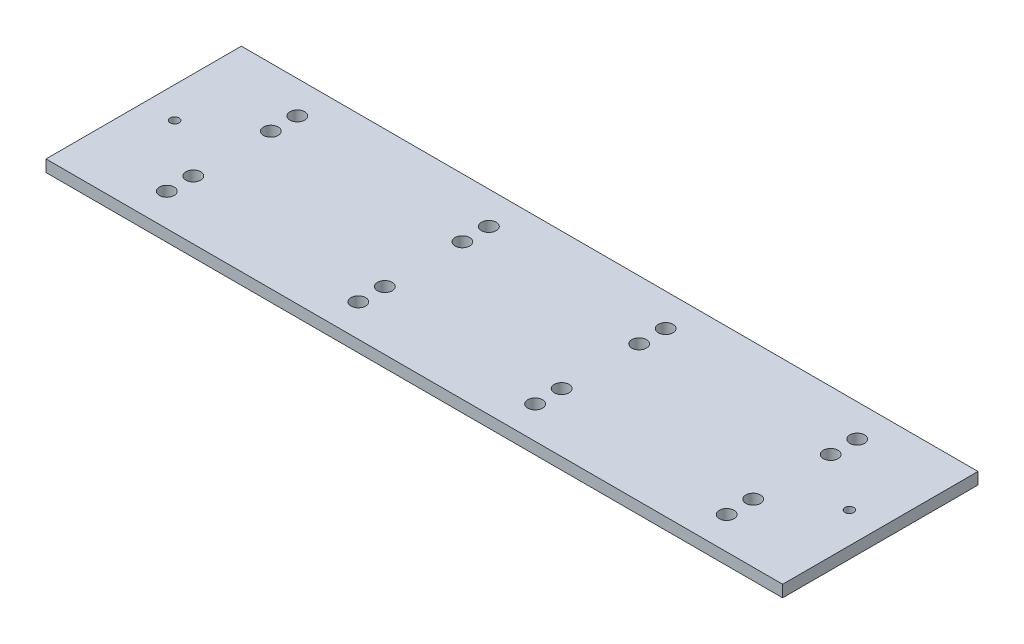
ISO-10303-21;
HEADER;
FILE_DESCRIPTION(('STEP AP214'),'2;1');
FILE_NAME('part.step','',(''),(''),'','','');
FILE_SCHEMA(('AUTOMOTIVE_DESIGN { 1 0 10303 214 1 1 1 1 }'));
ENDSEC;
DATA;
#1=APPLICATION_CONTEXT('core data for automotive mechanical design processes');
#2=APPLICATION_PROTOCOL_DEFINITION('international standard','automotive_design',2000,#1);
#3=PRODUCT_CONTEXT('',#1,'mechanical');
#4=PRODUCT('Part','Part','',(#3));
#5=PRODUCT_RELATED_PRODUCT_CATEGORY('part','',(#4));
#6=PRODUCT_DEFINITION_FORMATION('','',#4);
#7=PRODUCT_DEFINITION_CONTEXT('part definition',#1,'design');
#8=PRODUCT_DEFINITION('design','',#6,#7);
#9=PRODUCT_DEFINITION_SHAPE('','',#8);
#10=(LENGTH_UNIT() NAMED_UNIT(*) SI_UNIT(.MILLI.,.METRE.));
#11=(NAMED_UNIT(*) PLANE_ANGLE_UNIT() SI_UNIT($,.RADIAN.));
#12=(NAMED_UNIT(*) SI_UNIT($,.STERADIAN.) SOLID_ANGLE_UNIT());
#13=UNCERTAINTY_MEASURE_WITH_UNIT(LENGTH_MEASURE(1.E-05),#10,'distance_accuracy_value','');
#14=(GEOMETRIC_REPRESENTATION_CONTEXT(3) GLOBAL_UNCERTAINTY_ASSIGNED_CONTEXT((#13)) GLOBAL_UNIT_ASSIGNED_CONTEXT((#10,
#11,#12)) REPRESENTATION_CONTEXT('',''));
#15=CARTESIAN_POINT('',(0.,0.,0.));
#16=DIRECTION('',(0.,0.,1.));
#17=DIRECTION('',(1.,0.,0.));
#18=AXIS2_PLACEMENT_3D('',#15,#16,#17);
#19=CARTESIAN_POINT('',(-125.,4.,-33.15));
#20=DIRECTION('',(1.,0.,0.));
#21=DIRECTION('',(0.,0.,-1.));
#22=AXIS2_PLACEMENT_3D('',#19,#20,#21);
#23=PLANE('',#22);
#24=DIRECTION('',(0.,0.,1.));
#25=VECTOR('',#24,1.);
#26=CARTESIAN_POINT('',(-125.,0.,-33.15));
#27=LINE('',#26,#25);
#28=CARTESIAN_POINT('',(-125.,0.,-33.15));
#29=VERTEX_POINT('',#28);
#30=CARTESIAN_POINT('',(-125.,0.,33.15));
#31=VERTEX_POINT('',#30);
#32=EDGE_CURVE('E105',#29,#31,#27,.T.);
#33=ORIENTED_EDGE('',*,*,#32,.T.);
#34=DIRECTION('',(0.,-1.,0.));
#35=VECTOR('',#34,1.);
#36=CARTESIAN_POINT('',(-125.,4.,33.15));
#37=LINE('',#36,#35);
#38=CARTESIAN_POINT('',(-125.,4.,33.15));
#39=VERTEX_POINT('',#38);
#40=EDGE_CURVE('E11',#39,#31,#37,.T.);
#41=ORIENTED_EDGE('',*,*,#40,.F.);
#42=DIRECTION('',(0.,0.,1.));
#43=VECTOR('',#42,1.);
#44=CARTESIAN_POINT('',(-125.,4.,-33.15));
#45=LINE('',#44,#43);
#46=CARTESIAN_POINT('',(-125.,4.,-33.15));
#47=VERTEX_POINT('',#46);
#48=EDGE_CURVE('E92',#47,#39,#45,.T.);
#49=ORIENTED_EDGE('',*,*,#48,.F.);
#50=DIRECTION('',(0.,-1.,0.));
#51=VECTOR('',#50,1.);
#52=CARTESIAN_POINT('',(-125.,4.,-33.15));
#53=LINE('',#52,#51);
#54=EDGE_CURVE('E101',#47,#29,#53,.T.);
#55=ORIENTED_EDGE('',*,*,#54,.T.);
#56=EDGE_LOOP('',(#33,#41,#49,#55));
#57=FACE_BOUND('',#56,.T.);
#58=ADVANCED_FACE('F39',(#57),#23,.F.);
#59=CARTESIAN_POINT('',(-125.,4.,33.15));
#60=DIRECTION('',(0.,0.,-1.));
#61=DIRECTION('',(-1.,0.,0.));
#62=AXIS2_PLACEMENT_3D('',#59,#60,#61);
#63=PLANE('',#62);
#64=DIRECTION('',(1.,0.,0.));
#65=VECTOR('',#64,1.);
#66=CARTESIAN_POINT('',(-125.,0.,33.15));
#67=LINE('',#66,#65);
#68=CARTESIAN_POINT('',(125.,0.,33.15));
#69=VERTEX_POINT('',#68);
#70=EDGE_CURVE('E96',#31,#69,#67,.T.);
#71=ORIENTED_EDGE('',*,*,#70,.T.);
#72=DIRECTION('',(0.,-1.,0.));
#73=VECTOR('',#72,1.);
#74=CARTESIAN_POINT('',(125.,4.,33.15));
#75=LINE('',#74,#73);
#76=CARTESIAN_POINT('',(125.,4.,33.15));
#77=VERTEX_POINT('',#76);
#78=EDGE_CURVE('E48',#77,#69,#75,.T.);
#79=ORIENTED_EDGE('',*,*,#78,.F.);
#80=DIRECTION('',(1.,0.,0.));
#81=VECTOR('',#80,1.);
#82=CARTESIAN_POINT('',(-125.,4.,33.15));
#83=LINE('',#82,#81);
#84=EDGE_CURVE('E87',#39,#77,#83,.T.);
#85=ORIENTED_EDGE('',*,*,#84,.F.);
#86=ORIENTED_EDGE('',*,*,#40,.T.);
#87=EDGE_LOOP('',(#71,#79,#85,#86));
#88=FACE_BOUND('',#87,.T.);
#89=ADVANCED_FACE('F95',(#88),#63,.F.);
#90=CARTESIAN_POINT('',(125.,4.,-33.15));
#91=DIRECTION('',(-1.,0.,0.));
#92=DIRECTION('',(0.,0.,1.));
#93=AXIS2_PLACEMENT_3D('',#90,#91,#92);
#94=PLANE('',#93);
#95=DIRECTION('',(0.,0.,-1.));
#96=VECTOR('',#95,1.);
#97=CARTESIAN_POINT('',(125.,0.,-33.15));
#98=LINE('',#97,#96);
#99=CARTESIAN_POINT('',(125.,0.,-33.15));
#100=VERTEX_POINT('',#99);
#101=EDGE_CURVE('E74',#69,#100,#98,.T.);
#102=ORIENTED_EDGE('',*,*,#101,.T.);
#103=DIRECTION('',(0.,-1.,0.));
#104=VECTOR('',#103,1.);
#105=CARTESIAN_POINT('',(125.,4.,-33.15));
#106=LINE('',#105,#104);
#107=CARTESIAN_POINT('',(125.,4.,-33.15));
#108=VERTEX_POINT('',#107);
#109=EDGE_CURVE('E97',#108,#100,#106,.T.);
#110=ORIENTED_EDGE('',*,*,#109,.F.);
#111=DIRECTION('',(0.,0.,-1.));
#112=VECTOR('',#111,1.);
#113=CARTESIAN_POINT('',(125.,4.,-33.15));
#114=LINE('',#113,#112);
#115=EDGE_CURVE('E90',#77,#108,#114,.T.);
#116=ORIENTED_EDGE('',*,*,#115,.F.);
#117=ORIENTED_EDGE('',*,*,#78,.T.);
#118=EDGE_LOOP('',(#102,#110,#116,#117));
#119=FACE_BOUND('',#118,.T.);
#120=ADVANCED_FACE('F99',(#119),#94,.F.);
#121=CARTESIAN_POINT('',(-125.,4.,-33.15));
#122=DIRECTION('',(0.,0.,1.));
#123=DIRECTION('',(1.,0.,0.));
#124=AXIS2_PLACEMENT_3D('',#121,#122,#123);
#125=PLANE('',#124);
#126=DIRECTION('',(-1.,0.,0.));
#127=VECTOR('',#126,1.);
#128=CARTESIAN_POINT('',(-125.,0.,-33.15));
#129=LINE('',#128,#127);
#130=EDGE_CURVE('E80',#100,#29,#129,.T.);
#131=ORIENTED_EDGE('',*,*,#130,.T.);
#132=ORIENTED_EDGE('',*,*,#54,.F.);
#133=DIRECTION('',(-1.,0.,0.));
#134=VECTOR('',#133,1.);
#135=CARTESIAN_POINT('',(-125.,4.,-33.15));
#136=LINE('',#135,#134);
#137=EDGE_CURVE('E57',#108,#47,#136,.T.);
#138=ORIENTED_EDGE('',*,*,#137,.F.);
#139=ORIENTED_EDGE('',*,*,#109,.T.);
#140=EDGE_LOOP('',(#131,#132,#138,#139));
#141=FACE_BOUND('',#140,.T.);
#142=ADVANCED_FACE('F241',(#141),#125,.F.);
#143=CARTESIAN_POINT('',(0.,4.,0.));
#144=DIRECTION('',(0.,1.,0.));
#145=DIRECTION('',(0.,0.,1.));
#146=AXIS2_PLACEMENT_3D('',#143,#144,#145);
#147=PLANE('',#146);
#148=CARTESIAN_POINT('',(-30.0000000000001,4.,22.15));
#149=DIRECTION('',(0.,1.,0.));
#150=DIRECTION('',(0.,0.,1.));
#151=AXIS2_PLACEMENT_3D('',#148,#149,#150);
#152=CIRCLE('',#151,2.49999999999999);
#153=CARTESIAN_POINT('',(-30.0000000000001,4.,24.65));
#154=VERTEX_POINT('',#153);
#155=EDGE_CURVE('E451',#154,#154,#152,.T.);
#156=ORIENTED_EDGE('',*,*,#155,.F.);
#157=EDGE_LOOP('',(#156));
#158=FACE_BOUND('',#157,.T.);
#159=CARTESIAN_POINT('',(-30.0000000000001,4.,13.15));
#160=DIRECTION('',(0.,1.,0.));
#161=DIRECTION('',(0.,0.,1.));
#162=AXIS2_PLACEMENT_3D('',#159,#160,#161);
#163=CIRCLE('',#162,2.49999999999999);
#164=CARTESIAN_POINT('',(-30.0000000000001,4.,15.65));
#165=VERTEX_POINT('',#164);
#166=EDGE_CURVE('E152',#165,#165,#163,.T.);
#167=ORIENTED_EDGE('',*,*,#166,.F.);
#168=EDGE_LOOP('',(#167));
#169=FACE_BOUND('',#168,.T.);
#170=CARTESIAN_POINT('',(-95.0000000000001,4.,22.15));
#171=DIRECTION('',(0.,1.,0.));
#172=DIRECTION('',(0.,0.,1.));
#173=AXIS2_PLACEMENT_3D('',#170,#171,#172);
#174=CIRCLE('',#173,2.49999999999999);
#175=CARTESIAN_POINT('',(-95.0000000000001,4.,24.65));
#176=VERTEX_POINT('',#175);
#177=EDGE_CURVE('E142',#176,#176,#174,.T.);
#178=ORIENTED_EDGE('',*,*,#177,.F.);
#179=EDGE_LOOP('',(#178));
#180=FACE_BOUND('',#179,.T.);
#181=CARTESIAN_POINT('',(-95.0000000000001,4.,13.15));
#182=DIRECTION('',(0.,1.,0.));
#183=DIRECTION('',(0.,0.,1.));
#184=AXIS2_PLACEMENT_3D('',#181,#182,#183);
#185=CIRCLE('',#184,2.49999999999999);
#186=CARTESIAN_POINT('',(-95.0000000000001,4.,15.65));
#187=VERTEX_POINT('',#186);
#188=EDGE_CURVE('E139',#187,#187,#185,.T.);
#189=ORIENTED_EDGE('',*,*,#188,.F.);
#190=EDGE_LOOP('',(#189));
#191=FACE_BOUND('',#190,.T.);
#192=CARTESIAN_POINT('',(30.0000000000001,4.,22.15));
#193=DIRECTION('',(0.,1.,0.));
#194=DIRECTION('',(0.,0.,1.));
#195=AXIS2_PLACEMENT_3D('',#192,#193,#194);
#196=CIRCLE('',#195,2.49999999999999);
#197=CARTESIAN_POINT('',(30.0000000000001,4.,24.65));
#198=VERTEX_POINT('',#197);
#199=EDGE_CURVE('E136',#198,#198,#196,.T.);
#200=ORIENTED_EDGE('',*,*,#199,.F.);
#201=EDGE_LOOP('',(#200));
#202=FACE_BOUND('',#201,.T.);
#203=CARTESIAN_POINT('',(30.0000000000001,4.,13.15));
#204=DIRECTION('',(0.,1.,0.));
#205=DIRECTION('',(0.,0.,1.));
#206=AXIS2_PLACEMENT_3D('',#203,#204,#205);
#207=CIRCLE('',#206,2.49999999999999);
#208=CARTESIAN_POINT('',(30.0000000000001,4.,15.65));
#209=VERTEX_POINT('',#208);
#210=EDGE_CURVE('E135',#209,#209,#207,.T.);
#211=ORIENTED_EDGE('',*,*,#210,.F.);
#212=EDGE_LOOP('',(#211));
#213=FACE_BOUND('',#212,.T.);
#214=CARTESIAN_POINT('',(95.0000000000001,4.,22.15));
#215=DIRECTION('',(0.,1.,0.));
#216=DIRECTION('',(0.,0.,1.));
#217=AXIS2_PLACEMENT_3D('',#214,#215,#216);
#218=CIRCLE('',#217,2.49999999999999);
#219=CARTESIAN_POINT('',(95.0000000000001,4.,24.65));
#220=VERTEX_POINT('',#219);
#221=EDGE_CURVE('E131',#220,#220,#218,.T.);
#222=ORIENTED_EDGE('',*,*,#221,.F.);
#223=EDGE_LOOP('',(#222));
#224=FACE_BOUND('',#223,.T.);
#225=CARTESIAN_POINT('',(95.0000000000001,4.,13.15));
#226=DIRECTION('',(0.,1.,0.));
#227=DIRECTION('',(0.,0.,1.));
#228=AXIS2_PLACEMENT_3D('',#225,#226,#227);
#229=CIRCLE('',#228,2.49999999999999);
#230=CARTESIAN_POINT('',(95.0000000000001,4.,15.65));
#231=VERTEX_POINT('',#230);
#232=EDGE_CURVE('E127',#231,#231,#229,.T.);
#233=ORIENTED_EDGE('',*,*,#232,.F.);
#234=EDGE_LOOP('',(#233));
#235=FACE_BOUND('',#234,.T.);
#236=CARTESIAN_POINT('',(30.0000000000001,4.,-22.15));
#237=DIRECTION('',(0.,1.,0.));
#238=DIRECTION('',(0.,0.,1.));
#239=AXIS2_PLACEMENT_3D('',#236,#237,#238);
#240=CIRCLE('',#239,2.49999999999999);
#241=CARTESIAN_POINT('',(30.0000000000001,4.,-19.65));
#242=VERTEX_POINT('',#241);
#243=EDGE_CURVE('E123',#242,#242,#240,.T.);
#244=ORIENTED_EDGE('',*,*,#243,.F.);
#245=EDGE_LOOP('',(#244));
#246=FACE_BOUND('',#245,.T.);
#247=CARTESIAN_POINT('',(30.0000000000001,4.,-13.15));
#248=DIRECTION('',(0.,1.,0.));
#249=DIRECTION('',(0.,0.,1.));
#250=AXIS2_PLACEMENT_3D('',#247,#248,#249);
#251=CIRCLE('',#250,2.49999999999999);
#252=CARTESIAN_POINT('',(30.0000000000001,4.,-10.65));
#253=VERTEX_POINT('',#252);
#254=EDGE_CURVE('E122',#253,#253,#251,.T.);
#255=ORIENTED_EDGE('',*,*,#254,.F.);
#256=EDGE_LOOP('',(#255));
#257=FACE_BOUND('',#256,.T.);
#258=CARTESIAN_POINT('',(95.0000000000001,4.,-22.15));
#259=DIRECTION('',(0.,1.,0.));
#260=DIRECTION('',(0.,0.,1.));
#261=AXIS2_PLACEMENT_3D('',#258,#259,#260);
#262=CIRCLE('',#261,2.49999999999999);
#263=CARTESIAN_POINT('',(95.0000000000001,4.,-19.65));
#264=VERTEX_POINT('',#263);
#265=EDGE_CURVE('E174',#264,#264,#262,.T.);
#266=ORIENTED_EDGE('',*,*,#265,.F.);
#267=EDGE_LOOP('',(#266));
#268=FACE_BOUND('',#267,.T.);
#269=CARTESIAN_POINT('',(95.0000000000001,4.,-13.15));
#270=DIRECTION('',(0.,1.,0.));
#271=DIRECTION('',(0.,0.,1.));
#272=AXIS2_PLACEMENT_3D('',#269,#270,#271);
#273=CIRCLE('',#272,2.49999999999999);
#274=CARTESIAN_POINT('',(95.0000000000001,4.,-10.65));
#275=VERTEX_POINT('',#274);
#276=EDGE_CURVE('E180',#275,#275,#273,.T.);
#277=ORIENTED_EDGE('',*,*,#276,.F.);
#278=EDGE_LOOP('',(#277));
#279=FACE_BOUND('',#278,.T.);
#280=CARTESIAN_POINT('',(114.5,4.,0.));
#281=DIRECTION('',(0.,1.,0.));
#282=DIRECTION('',(0.,0.,1.));
#283=AXIS2_PLACEMENT_3D('',#280,#281,#282);
#284=CIRCLE('',#283,1.49999999999999);
#285=CARTESIAN_POINT('',(114.5,4.,1.49999999999999));
#286=VERTEX_POINT('',#285);
#287=EDGE_CURVE('E118',#286,#286,#284,.T.);
#288=ORIENTED_EDGE('',*,*,#287,.F.);
#289=EDGE_LOOP('',(#288));
#290=FACE_BOUND('',#289,.T.);
#291=CARTESIAN_POINT('',(-30.0000000000001,4.,-13.15));
#292=DIRECTION('',(0.,1.,0.));
#293=DIRECTION('',(0.,0.,1.));
#294=AXIS2_PLACEMENT_3D('',#291,#292,#293);
#295=CIRCLE('',#294,2.49999999999999);
#296=CARTESIAN_POINT('',(-30.0000000000001,4.,-10.65));
#297=VERTEX_POINT('',#296);
#298=EDGE_CURVE('E117',#297,#297,#295,.T.);
#299=ORIENTED_EDGE('',*,*,#298,.F.);
#300=EDGE_LOOP('',(#299));
#301=FACE_BOUND('',#300,.T.);
#302=CARTESIAN_POINT('',(-30.0000000000001,4.,-22.15));
#303=DIRECTION('',(0.,1.,0.));
#304=DIRECTION('',(0.,0.,1.));
#305=AXIS2_PLACEMENT_3D('',#302,#303,#304);
#306=CIRCLE('',#305,2.49999999999999);
#307=CARTESIAN_POINT('',(-30.0000000000001,4.,-19.65));
#308=VERTEX_POINT('',#307);
#309=EDGE_CURVE('E193',#308,#308,#306,.T.);
#310=ORIENTED_EDGE('',*,*,#309,.F.);
#311=EDGE_LOOP('',(#310));
#312=FACE_BOUND('',#311,.T.);
#313=CARTESIAN_POINT('',(-95.0000000000001,4.,-22.15));
#314=DIRECTION('',(0.,1.,0.));
#315=DIRECTION('',(0.,0.,1.));
#316=AXIS2_PLACEMENT_3D('',#313,#314,#315);
#317=CIRCLE('',#316,2.49999999999999);
#318=CARTESIAN_POINT('',(-95.0000000000001,4.,-19.65));
#319=VERTEX_POINT('',#318);
#320=EDGE_CURVE('E199',#319,#319,#317,.T.);
#321=ORIENTED_EDGE('',*,*,#320,.F.);
#322=EDGE_LOOP('',(#321));
#323=FACE_BOUND('',#322,.T.);
#324=CARTESIAN_POINT('',(-95.0000000000001,4.,-13.15));
#325=DIRECTION('',(0.,1.,0.));
#326=DIRECTION('',(0.,0.,1.));
#327=AXIS2_PLACEMENT_3D('',#324,#325,#326);
#328=CIRCLE('',#327,2.49999999999999);
#329=CARTESIAN_POINT('',(-95.0000000000001,4.,-10.65));
#330=VERTEX_POINT('',#329);
#331=EDGE_CURVE('E205',#330,#330,#328,.T.);
#332=ORIENTED_EDGE('',*,*,#331,.F.);
#333=EDGE_LOOP('',(#332));
#334=FACE_BOUND('',#333,.T.);
#335=CARTESIAN_POINT('',(-114.5,4.,0.));
#336=DIRECTION('',(0.,1.,0.));
#337=DIRECTION('',(0.,0.,1.));
#338=AXIS2_PLACEMENT_3D('',#335,#336,#337);
#339=CIRCLE('',#338,1.49999999999999);
#340=CARTESIAN_POINT('',(-114.5,4.,1.49999999999999));
#341=VERTEX_POINT('',#340);
#342=EDGE_CURVE('E211',#341,#341,#339,.T.);
#343=ORIENTED_EDGE('',*,*,#342,.F.);
#344=EDGE_LOOP('',(#343));
#345=FACE_BOUND('',#344,.T.);
#346=ORIENTED_EDGE('',*,*,#48,.T.);
#347=ORIENTED_EDGE('',*,*,#84,.T.);
#348=ORIENTED_EDGE('',*,*,#115,.T.);
#349=ORIENTED_EDGE('',*,*,#137,.T.);
#350=EDGE_LOOP('',(#346,#347,#348,#349));
#351=FACE_BOUND('',#350,.T.);
#352=ADVANCED_FACE('F88',(#158,#169,#180,#191,#202,#213,#224,#235,#246,#257,#268,#279,#290,#301,
#312,#323,#334,#345,#351),#147,.T.);
#353=CARTESIAN_POINT('',(0.,0.,0.));
#354=DIRECTION('',(0.,1.,0.));
#355=DIRECTION('',(0.,0.,1.));
#356=AXIS2_PLACEMENT_3D('',#353,#354,#355);
#357=PLANE('',#356);
#358=CARTESIAN_POINT('',(-30.0000000000001,0.,22.15));
#359=DIRECTION('',(0.,1.,0.));
#360=DIRECTION('',(0.,0.,1.));
#361=AXIS2_PLACEMENT_3D('',#358,#359,#360);
#362=CIRCLE('',#361,2.49999999999999);
#363=CARTESIAN_POINT('',(-30.0000000000001,0.,24.65));
#364=VERTEX_POINT('',#363);
#365=EDGE_CURVE('E454',#364,#364,#362,.T.);
#366=ORIENTED_EDGE('',*,*,#365,.T.);
#367=EDGE_LOOP('',(#366));
#368=FACE_BOUND('',#367,.T.);
#369=CARTESIAN_POINT('',(-30.0000000000001,0.,13.15));
#370=DIRECTION('',(0.,1.,0.));
#371=DIRECTION('',(0.,0.,1.));
#372=AXIS2_PLACEMENT_3D('',#369,#370,#371);
#373=CIRCLE('',#372,2.49999999999999);
#374=CARTESIAN_POINT('',(-30.0000000000001,0.,15.65));
#375=VERTEX_POINT('',#374);
#376=EDGE_CURVE('E42',#375,#375,#373,.T.);
#377=ORIENTED_EDGE('',*,*,#376,.T.);
#378=EDGE_LOOP('',(#377));
#379=FACE_BOUND('',#378,.T.);
#380=CARTESIAN_POINT('',(-95.0000000000001,0.,22.15));
#381=DIRECTION('',(0.,1.,0.));
#382=DIRECTION('',(0.,0.,1.));
#383=AXIS2_PLACEMENT_3D('',#380,#381,#382);
#384=CIRCLE('',#383,2.49999999999999);
#385=CARTESIAN_POINT('',(-95.0000000000001,0.,24.65));
#386=VERTEX_POINT('',#385);
#387=EDGE_CURVE('E140',#386,#386,#384,.T.);
#388=ORIENTED_EDGE('',*,*,#387,.T.);
#389=EDGE_LOOP('',(#388));
#390=FACE_BOUND('',#389,.T.);
#391=CARTESIAN_POINT('',(-95.0000000000001,0.,13.15));
#392=DIRECTION('',(0.,1.,0.));
#393=DIRECTION('',(0.,0.,1.));
#394=AXIS2_PLACEMENT_3D('',#391,#392,#393);
#395=CIRCLE('',#394,2.49999999999999);
#396=CARTESIAN_POINT('',(-95.0000000000001,0.,15.65));
#397=VERTEX_POINT('',#396);
#398=EDGE_CURVE('E137',#397,#397,#395,.T.);
#399=ORIENTED_EDGE('',*,*,#398,.T.);
#400=EDGE_LOOP('',(#399));
#401=FACE_BOUND('',#400,.T.);
#402=CARTESIAN_POINT('',(30.0000000000001,0.,22.15));
#403=DIRECTION('',(0.,1.,0.));
#404=DIRECTION('',(0.,0.,1.));
#405=AXIS2_PLACEMENT_3D('',#402,#403,#404);
#406=CIRCLE('',#405,2.49999999999999);
#407=CARTESIAN_POINT('',(30.0000000000001,0.,24.65));
#408=VERTEX_POINT('',#407);
#409=EDGE_CURVE('E132',#408,#408,#406,.T.);
#410=ORIENTED_EDGE('',*,*,#409,.T.);
#411=EDGE_LOOP('',(#410));
#412=FACE_BOUND('',#411,.T.);
#413=CARTESIAN_POINT('',(30.0000000000001,0.,13.15));
#414=DIRECTION('',(0.,1.,0.));
#415=DIRECTION('',(0.,0.,1.));
#416=AXIS2_PLACEMENT_3D('',#413,#414,#415);
#417=CIRCLE('',#416,2.49999999999999);
#418=CARTESIAN_POINT('',(30.0000000000001,0.,15.65));
#419=VERTEX_POINT('',#418);
#420=EDGE_CURVE('E160',#419,#419,#417,.T.);
#421=ORIENTED_EDGE('',*,*,#420,.T.);
#422=EDGE_LOOP('',(#421));
#423=FACE_BOUND('',#422,.T.);
#424=CARTESIAN_POINT('',(95.0000000000001,0.,22.15));
#425=DIRECTION('',(0.,1.,0.));
#426=DIRECTION('',(0.,0.,1.));
#427=AXIS2_PLACEMENT_3D('',#424,#425,#426);
#428=CIRCLE('',#427,2.49999999999999);
#429=CARTESIAN_POINT('',(95.0000000000001,0.,24.65));
#430=VERTEX_POINT('',#429);
#431=EDGE_CURVE('E128',#430,#430,#428,.T.);
#432=ORIENTED_EDGE('',*,*,#431,.T.);
#433=EDGE_LOOP('',(#432));
#434=FACE_BOUND('',#433,.T.);
#435=CARTESIAN_POINT('',(95.0000000000001,0.,13.15));
#436=DIRECTION('',(0.,1.,0.));
#437=DIRECTION('',(0.,0.,1.));
#438=AXIS2_PLACEMENT_3D('',#435,#436,#437);
#439=CIRCLE('',#438,2.49999999999999);
#440=CARTESIAN_POINT('',(95.0000000000001,0.,15.65));
#441=VERTEX_POINT('',#440);
#442=EDGE_CURVE('E124',#441,#441,#439,.T.);
#443=ORIENTED_EDGE('',*,*,#442,.T.);
#444=EDGE_LOOP('',(#443));
#445=FACE_BOUND('',#444,.T.);
#446=CARTESIAN_POINT('',(30.0000000000001,0.,-22.15));
#447=DIRECTION('',(0.,1.,0.));
#448=DIRECTION('',(0.,0.,1.));
#449=AXIS2_PLACEMENT_3D('',#446,#447,#448);
#450=CIRCLE('',#449,2.49999999999999);
#451=CARTESIAN_POINT('',(30.0000000000001,0.,-19.65));
#452=VERTEX_POINT('',#451);
#453=EDGE_CURVE('E119',#452,#452,#450,.T.);
#454=ORIENTED_EDGE('',*,*,#453,.T.);
#455=EDGE_LOOP('',(#454));
#456=FACE_BOUND('',#455,.T.);
#457=CARTESIAN_POINT('',(30.0000000000001,0.,-13.15));
#458=DIRECTION('',(0.,1.,0.));
#459=DIRECTION('',(0.,0.,1.));
#460=AXIS2_PLACEMENT_3D('',#457,#458,#459);
#461=CIRCLE('',#460,2.49999999999999);
#462=CARTESIAN_POINT('',(30.0000000000001,0.,-10.65));
#463=VERTEX_POINT('',#462);
#464=EDGE_CURVE('E171',#463,#463,#461,.T.);
#465=ORIENTED_EDGE('',*,*,#464,.T.);
#466=EDGE_LOOP('',(#465));
#467=FACE_BOUND('',#466,.T.);
#468=CARTESIAN_POINT('',(95.0000000000001,0.,-22.15));
#469=DIRECTION('',(0.,1.,0.));
#470=DIRECTION('',(0.,0.,1.));
#471=AXIS2_PLACEMENT_3D('',#468,#469,#470);
#472=CIRCLE('',#471,2.49999999999999);
#473=CARTESIAN_POINT('',(95.0000000000001,0.,-19.65));
#474=VERTEX_POINT('',#473);
#475=EDGE_CURVE('E177',#474,#474,#472,.T.);
#476=ORIENTED_EDGE('',*,*,#475,.T.);
#477=EDGE_LOOP('',(#476));
#478=FACE_BOUND('',#477,.T.);
#479=CARTESIAN_POINT('',(95.0000000000001,0.,-13.15));
#480=DIRECTION('',(0.,1.,0.));
#481=DIRECTION('',(0.,0.,1.));
#482=AXIS2_PLACEMENT_3D('',#479,#480,#481);
#483=CIRCLE('',#482,2.49999999999999);
#484=CARTESIAN_POINT('',(95.0000000000001,0.,-10.65));
#485=VERTEX_POINT('',#484);
#486=EDGE_CURVE('E183',#485,#485,#483,.T.);
#487=ORIENTED_EDGE('',*,*,#486,.T.);
#488=EDGE_LOOP('',(#487));
#489=FACE_BOUND('',#488,.T.);
#490=CARTESIAN_POINT('',(114.5,0.,0.));
#491=DIRECTION('',(0.,1.,0.));
#492=DIRECTION('',(0.,0.,1.));
#493=AXIS2_PLACEMENT_3D('',#490,#491,#492);
#494=CIRCLE('',#493,1.49999999999999);
#495=CARTESIAN_POINT('',(114.5,0.,1.49999999999999));
#496=VERTEX_POINT('',#495);
#497=EDGE_CURVE('E114',#496,#496,#494,.T.);
#498=ORIENTED_EDGE('',*,*,#497,.T.);
#499=EDGE_LOOP('',(#498));
#500=FACE_BOUND('',#499,.T.);
#501=CARTESIAN_POINT('',(-30.0000000000001,0.,-13.15));
#502=DIRECTION('',(0.,1.,0.));
#503=DIRECTION('',(0.,0.,1.));
#504=AXIS2_PLACEMENT_3D('',#501,#502,#503);
#505=CIRCLE('',#504,2.49999999999999);
#506=CARTESIAN_POINT('',(-30.0000000000001,0.,-10.65));
#507=VERTEX_POINT('',#506);
#508=EDGE_CURVE('E190',#507,#507,#505,.T.);
#509=ORIENTED_EDGE('',*,*,#508,.T.);
#510=EDGE_LOOP('',(#509));
#511=FACE_BOUND('',#510,.T.);
#512=CARTESIAN_POINT('',(-30.0000000000001,0.,-22.15));
#513=DIRECTION('',(0.,1.,0.));
#514=DIRECTION('',(0.,0.,1.));
#515=AXIS2_PLACEMENT_3D('',#512,#513,#514);
#516=CIRCLE('',#515,2.49999999999999);
#517=CARTESIAN_POINT('',(-30.0000000000001,0.,-19.65));
#518=VERTEX_POINT('',#517);
#519=EDGE_CURVE('E196',#518,#518,#516,.T.);
#520=ORIENTED_EDGE('',*,*,#519,.T.);
#521=EDGE_LOOP('',(#520));
#522=FACE_BOUND('',#521,.T.);
#523=CARTESIAN_POINT('',(-95.0000000000001,0.,-22.15));
#524=DIRECTION('',(0.,1.,0.));
#525=DIRECTION('',(0.,0.,1.));
#526=AXIS2_PLACEMENT_3D('',#523,#524,#525);
#527=CIRCLE('',#526,2.49999999999999);
#528=CARTESIAN_POINT('',(-95.0000000000001,0.,-19.65));
#529=VERTEX_POINT('',#528);
#530=EDGE_CURVE('E202',#529,#529,#527,.T.);
#531=ORIENTED_EDGE('',*,*,#530,.T.);
#532=EDGE_LOOP('',(#531));
#533=FACE_BOUND('',#532,.T.);
#534=CARTESIAN_POINT('',(-95.0000000000001,0.,-13.15));
#535=DIRECTION('',(0.,1.,0.));
#536=DIRECTION('',(0.,0.,1.));
#537=AXIS2_PLACEMENT_3D('',#534,#535,#536);
#538=CIRCLE('',#537,2.49999999999999);
#539=CARTESIAN_POINT('',(-95.0000000000001,0.,-10.65));
#540=VERTEX_POINT('',#539);
#541=EDGE_CURVE('E208',#540,#540,#538,.T.);
#542=ORIENTED_EDGE('',*,*,#541,.T.);
#543=EDGE_LOOP('',(#542));
#544=FACE_BOUND('',#543,.T.);
#545=CARTESIAN_POINT('',(-114.5,0.,0.));
#546=DIRECTION('',(0.,1.,0.));
#547=DIRECTION('',(0.,0.,1.));
#548=AXIS2_PLACEMENT_3D('',#545,#546,#547);
#549=CIRCLE('',#548,1.49999999999999);
#550=CARTESIAN_POINT('',(-114.5,0.,1.49999999999999));
#551=VERTEX_POINT('',#550);
#552=EDGE_CURVE('E108',#551,#551,#549,.T.);
#553=ORIENTED_EDGE('',*,*,#552,.T.);
#554=EDGE_LOOP('',(#553));
#555=FACE_BOUND('',#554,.T.);
#556=ORIENTED_EDGE('',*,*,#32,.F.);
#557=ORIENTED_EDGE('',*,*,#130,.F.);
#558=ORIENTED_EDGE('',*,*,#101,.F.);
#559=ORIENTED_EDGE('',*,*,#70,.F.);
#560=EDGE_LOOP('',(#556,#557,#558,#559));
#561=FACE_BOUND('',#560,.T.);
#562=ADVANCED_FACE('F217',(#368,#379,#390,#401,#412,#423,#434,#445,#456,#467,#478,#489,#500,
#511,#522,#533,#544,#555,#561),#357,.F.);
#563=CARTESIAN_POINT('',(-114.5,4.,0.));
#564=DIRECTION('',(0.,1.,0.));
#565=DIRECTION('',(0.,0.,1.));
#566=AXIS2_PLACEMENT_3D('',#563,#564,#565);
#567=CYLINDRICAL_SURFACE('',#566,1.49999999999999);
#568=ORIENTED_EDGE('',*,*,#342,.T.);
#569=EDGE_LOOP('',(#568));
#570=FACE_BOUND('',#569,.T.);
#571=ORIENTED_EDGE('',*,*,#552,.F.);
#572=EDGE_LOOP('',(#571));
#573=FACE_BOUND('',#572,.T.);
#574=ADVANCED_FACE('F220',(#570,#573),#567,.F.);
#575=CARTESIAN_POINT('',(-95.0000000000001,4.,-13.15));
#576=DIRECTION('',(0.,1.,0.));
#577=DIRECTION('',(0.,0.,1.));
#578=AXIS2_PLACEMENT_3D('',#575,#576,#577);
#579=CYLINDRICAL_SURFACE('',#578,2.49999999999999);
#580=ORIENTED_EDGE('',*,*,#331,.T.);
#581=EDGE_LOOP('',(#580));
#582=FACE_BOUND('',#581,.T.);
#583=ORIENTED_EDGE('',*,*,#541,.F.);
#584=EDGE_LOOP('',(#583));
#585=FACE_BOUND('',#584,.T.);
#586=ADVANCED_FACE('F222',(#582,#585),#579,.F.);
#587=CARTESIAN_POINT('',(-95.0000000000001,4.,-22.15));
#588=DIRECTION('',(0.,1.,0.));
#589=DIRECTION('',(0.,0.,1.));
#590=AXIS2_PLACEMENT_3D('',#587,#588,#589);
#591=CYLINDRICAL_SURFACE('',#590,2.49999999999999);
#592=ORIENTED_EDGE('',*,*,#320,.T.);
#593=EDGE_LOOP('',(#592));
#594=FACE_BOUND('',#593,.T.);
#595=ORIENTED_EDGE('',*,*,#530,.F.);
#596=EDGE_LOOP('',(#595));
#597=FACE_BOUND('',#596,.T.);
#598=ADVANCED_FACE('F229',(#594,#597),#591,.F.);
#599=CARTESIAN_POINT('',(-30.0000000000001,4.,-22.15));
#600=DIRECTION('',(0.,1.,0.));
#601=DIRECTION('',(0.,0.,1.));
#602=AXIS2_PLACEMENT_3D('',#599,#600,#601);
#603=CYLINDRICAL_SURFACE('',#602,2.49999999999999);
#604=ORIENTED_EDGE('',*,*,#309,.T.);
#605=EDGE_LOOP('',(#604));
#606=FACE_BOUND('',#605,.T.);
#607=ORIENTED_EDGE('',*,*,#519,.F.);
#608=EDGE_LOOP('',(#607));
#609=FACE_BOUND('',#608,.T.);
#610=ADVANCED_FACE('F297',(#606,#609),#603,.F.);
#611=CARTESIAN_POINT('',(-30.0000000000001,4.,-13.15));
#612=DIRECTION('',(0.,1.,0.));
#613=DIRECTION('',(0.,0.,1.));
#614=AXIS2_PLACEMENT_3D('',#611,#612,#613);
#615=CYLINDRICAL_SURFACE('',#614,2.49999999999999);
#616=ORIENTED_EDGE('',*,*,#298,.T.);
#617=EDGE_LOOP('',(#616));
#618=FACE_BOUND('',#617,.T.);
#619=ORIENTED_EDGE('',*,*,#508,.F.);
#620=EDGE_LOOP('',(#619));
#621=FACE_BOUND('',#620,.T.);
#622=ADVANCED_FACE('F306',(#618,#621),#615,.F.);
#623=CARTESIAN_POINT('',(114.5,4.,0.));
#624=DIRECTION('',(0.,1.,0.));
#625=DIRECTION('',(0.,0.,1.));
#626=AXIS2_PLACEMENT_3D('',#623,#624,#625);
#627=CYLINDRICAL_SURFACE('',#626,1.49999999999999);
#628=ORIENTED_EDGE('',*,*,#287,.T.);
#629=EDGE_LOOP('',(#628));
#630=FACE_BOUND('',#629,.T.);
#631=ORIENTED_EDGE('',*,*,#497,.F.);
#632=EDGE_LOOP('',(#631));
#633=FACE_BOUND('',#632,.T.);
#634=ADVANCED_FACE('F315',(#630,#633),#627,.F.);
#635=CARTESIAN_POINT('',(95.0000000000001,4.,-13.15));
#636=DIRECTION('',(0.,1.,0.));
#637=DIRECTION('',(0.,0.,1.));
#638=AXIS2_PLACEMENT_3D('',#635,#636,#637);
#639=CYLINDRICAL_SURFACE('',#638,2.49999999999999);
#640=ORIENTED_EDGE('',*,*,#276,.T.);
#641=EDGE_LOOP('',(#640));
#642=FACE_BOUND('',#641,.T.);
#643=ORIENTED_EDGE('',*,*,#486,.F.);
#644=EDGE_LOOP('',(#643));
#645=FACE_BOUND('',#644,.T.);
#646=ADVANCED_FACE('F324',(#642,#645),#639,.F.);
#647=CARTESIAN_POINT('',(95.0000000000001,4.,-22.15));
#648=DIRECTION('',(0.,1.,0.));
#649=DIRECTION('',(0.,0.,1.));
#650=AXIS2_PLACEMENT_3D('',#647,#648,#649);
#651=CYLINDRICAL_SURFACE('',#650,2.49999999999999);
#652=ORIENTED_EDGE('',*,*,#265,.T.);
#653=EDGE_LOOP('',(#652));
#654=FACE_BOUND('',#653,.T.);
#655=ORIENTED_EDGE('',*,*,#475,.F.);
#656=EDGE_LOOP('',(#655));
#657=FACE_BOUND('',#656,.T.);
#658=ADVANCED_FACE('F333',(#654,#657),#651,.F.);
#659=CARTESIAN_POINT('',(30.0000000000001,4.,-13.15));
#660=DIRECTION('',(0.,1.,0.));
#661=DIRECTION('',(0.,0.,1.));
#662=AXIS2_PLACEMENT_3D('',#659,#660,#661);
#663=CYLINDRICAL_SURFACE('',#662,2.49999999999999);
#664=ORIENTED_EDGE('',*,*,#254,.T.);
#665=EDGE_LOOP('',(#664));
#666=FACE_BOUND('',#665,.T.);
#667=ORIENTED_EDGE('',*,*,#464,.F.);
#668=EDGE_LOOP('',(#667));
#669=FACE_BOUND('',#668,.T.);
#670=ADVANCED_FACE('F342',(#666,#669),#663,.F.);
#671=CARTESIAN_POINT('',(30.0000000000001,4.,-22.15));
#672=DIRECTION('',(0.,1.,0.));
#673=DIRECTION('',(0.,0.,1.));
#674=AXIS2_PLACEMENT_3D('',#671,#672,#673);
#675=CYLINDRICAL_SURFACE('',#674,2.49999999999999);
#676=ORIENTED_EDGE('',*,*,#243,.T.);
#677=EDGE_LOOP('',(#676));
#678=FACE_BOUND('',#677,.T.);
#679=ORIENTED_EDGE('',*,*,#453,.F.);
#680=EDGE_LOOP('',(#679));
#681=FACE_BOUND('',#680,.T.);
#682=ADVANCED_FACE('F351',(#678,#681),#675,.F.);
#683=CARTESIAN_POINT('',(95.0000000000001,4.,13.15));
#684=DIRECTION('',(0.,1.,0.));
#685=DIRECTION('',(0.,0.,1.));
#686=AXIS2_PLACEMENT_3D('',#683,#684,#685);
#687=CYLINDRICAL_SURFACE('',#686,2.49999999999999);
#688=ORIENTED_EDGE('',*,*,#232,.T.);
#689=EDGE_LOOP('',(#688));
#690=FACE_BOUND('',#689,.T.);
#691=ORIENTED_EDGE('',*,*,#442,.F.);
#692=EDGE_LOOP('',(#691));
#693=FACE_BOUND('',#692,.T.);
#694=ADVANCED_FACE('F359',(#690,#693),#687,.F.);
#695=CARTESIAN_POINT('',(95.0000000000001,4.,22.15));
#696=DIRECTION('',(0.,1.,0.));
#697=DIRECTION('',(0.,0.,1.));
#698=AXIS2_PLACEMENT_3D('',#695,#696,#697);
#699=CYLINDRICAL_SURFACE('',#698,2.49999999999999);
#700=ORIENTED_EDGE('',*,*,#221,.T.);
#701=EDGE_LOOP('',(#700));
#702=FACE_BOUND('',#701,.T.);
#703=ORIENTED_EDGE('',*,*,#431,.F.);
#704=EDGE_LOOP('',(#703));
#705=FACE_BOUND('',#704,.T.);
#706=ADVANCED_FACE('F367',(#702,#705),#699,.F.);
#707=CARTESIAN_POINT('',(30.0000000000001,4.,13.15));
#708=DIRECTION('',(0.,1.,0.));
#709=DIRECTION('',(0.,0.,1.));
#710=AXIS2_PLACEMENT_3D('',#707,#708,#709);
#711=CYLINDRICAL_SURFACE('',#710,2.49999999999999);
#712=ORIENTED_EDGE('',*,*,#210,.T.);
#713=EDGE_LOOP('',(#712));
#714=FACE_BOUND('',#713,.T.);
#715=ORIENTED_EDGE('',*,*,#420,.F.);
#716=EDGE_LOOP('',(#715));
#717=FACE_BOUND('',#716,.T.);
#718=ADVANCED_FACE('F376',(#714,#717),#711,.F.);
#719=CARTESIAN_POINT('',(30.0000000000001,4.,22.15));
#720=DIRECTION('',(0.,1.,0.));
#721=DIRECTION('',(0.,0.,1.));
#722=AXIS2_PLACEMENT_3D('',#719,#720,#721);
#723=CYLINDRICAL_SURFACE('',#722,2.49999999999999);
#724=ORIENTED_EDGE('',*,*,#199,.T.);
#725=EDGE_LOOP('',(#724));
#726=FACE_BOUND('',#725,.T.);
#727=ORIENTED_EDGE('',*,*,#409,.F.);
#728=EDGE_LOOP('',(#727));
#729=FACE_BOUND('',#728,.T.);
#730=ADVANCED_FACE('F385',(#726,#729),#723,.F.);
#731=CARTESIAN_POINT('',(-95.0000000000001,4.,13.15));
#732=DIRECTION('',(0.,1.,0.));
#733=DIRECTION('',(0.,0.,1.));
#734=AXIS2_PLACEMENT_3D('',#731,#732,#733);
#735=CYLINDRICAL_SURFACE('',#734,2.49999999999999);
#736=ORIENTED_EDGE('',*,*,#188,.T.);
#737=EDGE_LOOP('',(#736));
#738=FACE_BOUND('',#737,.T.);
#739=ORIENTED_EDGE('',*,*,#398,.F.);
#740=EDGE_LOOP('',(#739));
#741=FACE_BOUND('',#740,.T.);
#742=ADVANCED_FACE('F394',(#738,#741),#735,.F.);
#743=CARTESIAN_POINT('',(-95.0000000000001,4.,22.15));
#744=DIRECTION('',(0.,1.,0.));
#745=DIRECTION('',(0.,0.,1.));
#746=AXIS2_PLACEMENT_3D('',#743,#744,#745);
#747=CYLINDRICAL_SURFACE('',#746,2.49999999999999);
#748=ORIENTED_EDGE('',*,*,#177,.T.);
#749=EDGE_LOOP('',(#748));
#750=FACE_BOUND('',#749,.T.);
#751=ORIENTED_EDGE('',*,*,#387,.F.);
#752=EDGE_LOOP('',(#751));
#753=FACE_BOUND('',#752,.T.);
#754=ADVANCED_FACE('F403',(#750,#753),#747,.F.);
#755=CARTESIAN_POINT('',(-30.0000000000001,4.,13.15));
#756=DIRECTION('',(0.,1.,0.));
#757=DIRECTION('',(0.,0.,1.));
#758=AXIS2_PLACEMENT_3D('',#755,#756,#757);
#759=CYLINDRICAL_SURFACE('',#758,2.49999999999999);
#760=ORIENTED_EDGE('',*,*,#166,.T.);
#761=EDGE_LOOP('',(#760));
#762=FACE_BOUND('',#761,.T.);
#763=ORIENTED_EDGE('',*,*,#376,.F.);
#764=EDGE_LOOP('',(#763));
#765=FACE_BOUND('',#764,.T.);
#766=ADVANCED_FACE('F412',(#762,#765),#759,.F.);
#767=CARTESIAN_POINT('',(-30.0000000000001,4.,22.15));
#768=DIRECTION('',(0.,1.,0.));
#769=DIRECTION('',(0.,0.,1.));
#770=AXIS2_PLACEMENT_3D('',#767,#768,#769);
#771=CYLINDRICAL_SURFACE('',#770,2.49999999999999);
#772=ORIENTED_EDGE('',*,*,#155,.T.);
#773=EDGE_LOOP('',(#772));
#774=FACE_BOUND('',#773,.T.);
#775=ORIENTED_EDGE('',*,*,#365,.F.);
#776=EDGE_LOOP('',(#775));
#777=FACE_BOUND('',#776,.T.);
#778=ADVANCED_FACE('F420',(#774,#777),#771,.F.);
#779=CLOSED_SHELL('',(#58,#89,#120,#142,#352,#562,#574,#586,#598,#610,#622,#634,#646,#658,#670,
#682,#694,#706,#718,#730,#742,#754,#766,#778));
#780=MANIFOLD_SOLID_BREP('B2',#779);
#781=ADVANCED_BREP_SHAPE_REPRESENTATION('',(#18,#780),#14);
#782=SHAPE_DEFINITION_REPRESENTATION(#9,#781);
ENDSEC;
END-ISO-10303-21;
